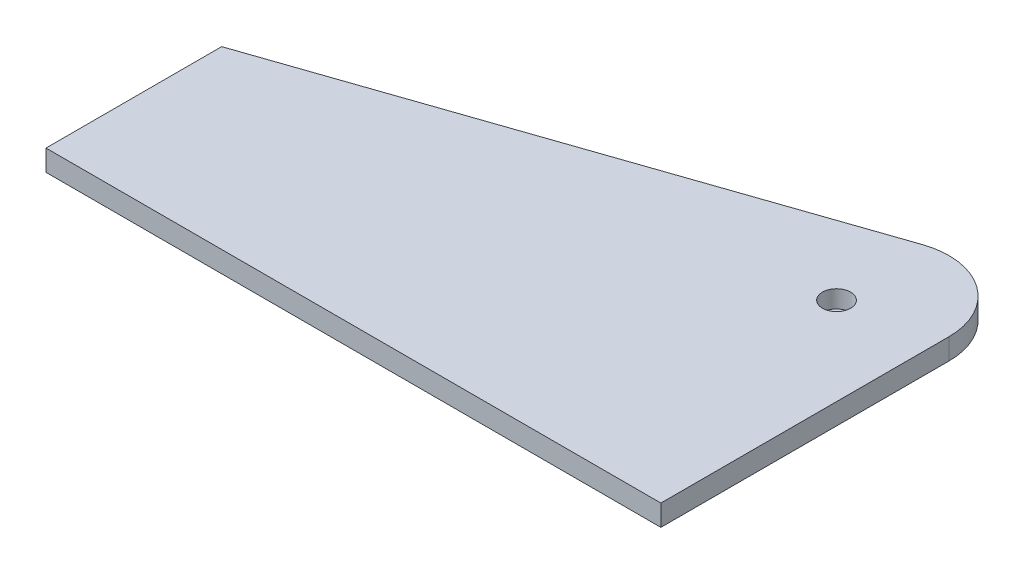
ISO-10303-21;
HEADER;
FILE_DESCRIPTION(('STEP AP214'),'2;1');
FILE_NAME('part.step','',(''),(''),'','','');
FILE_SCHEMA(('AUTOMOTIVE_DESIGN { 1 0 10303 214 1 1 1 1 }'));
ENDSEC;
DATA;
#1=APPLICATION_CONTEXT('core data for automotive mechanical design processes');
#2=APPLICATION_PROTOCOL_DEFINITION('international standard','automotive_design',2000,#1);
#3=PRODUCT_CONTEXT('',#1,'mechanical');
#4=PRODUCT('Part','Part','',(#3));
#5=PRODUCT_RELATED_PRODUCT_CATEGORY('part','',(#4));
#6=PRODUCT_DEFINITION_FORMATION('','',#4);
#7=PRODUCT_DEFINITION_CONTEXT('part definition',#1,'design');
#8=PRODUCT_DEFINITION('design','',#6,#7);
#9=PRODUCT_DEFINITION_SHAPE('','',#8);
#10=(LENGTH_UNIT() NAMED_UNIT(*) SI_UNIT(.MILLI.,.METRE.));
#11=(NAMED_UNIT(*) PLANE_ANGLE_UNIT() SI_UNIT($,.RADIAN.));
#12=(NAMED_UNIT(*) SI_UNIT($,.STERADIAN.) SOLID_ANGLE_UNIT());
#13=UNCERTAINTY_MEASURE_WITH_UNIT(LENGTH_MEASURE(1.E-05),#10,'distance_accuracy_value','');
#14=(GEOMETRIC_REPRESENTATION_CONTEXT(3) GLOBAL_UNCERTAINTY_ASSIGNED_CONTEXT((#13)) GLOBAL_UNIT_ASSIGNED_CONTEXT((#10,
#11,#12)) REPRESENTATION_CONTEXT('',''));
#15=CARTESIAN_POINT('',(0.,0.,0.));
#16=DIRECTION('',(0.,0.,1.));
#17=DIRECTION('',(1.,0.,0.));
#18=AXIS2_PLACEMENT_3D('',#15,#16,#17);
#19=CARTESIAN_POINT('',(87.5,6.,0.));
#20=DIRECTION('',(-1.,0.,0.));
#21=DIRECTION('',(0.,0.,1.));
#22=AXIS2_PLACEMENT_3D('',#19,#20,#21);
#23=PLANE('',#22);
#24=DIRECTION('',(0.,0.,-1.));
#25=VECTOR('',#24,1.);
#26=CARTESIAN_POINT('',(87.5,0.,0.));
#27=LINE('',#26,#25);
#28=CARTESIAN_POINT('',(87.5,0.,50.));
#29=VERTEX_POINT('',#28);
#30=CARTESIAN_POINT('',(87.5,0.,-32.0052135660813));
#31=VERTEX_POINT('',#30);
#32=EDGE_CURVE('E121',#29,#31,#27,.T.);
#33=ORIENTED_EDGE('',*,*,#32,.T.);
#34=DIRECTION('',(0.,-1.,0.));
#35=VECTOR('',#34,1.);
#36=CARTESIAN_POINT('',(87.5,6.,-32.0052135660813));
#37=LINE('',#36,#35);
#38=CARTESIAN_POINT('',(87.5,6.,-32.0052135660813));
#39=VERTEX_POINT('',#38);
#40=EDGE_CURVE('E50',#31,#39,#37,.F.);
#41=ORIENTED_EDGE('',*,*,#40,.T.);
#42=DIRECTION('',(0.,0.,-1.));
#43=VECTOR('',#42,1.);
#44=CARTESIAN_POINT('',(87.5,6.,0.));
#45=LINE('',#44,#43);
#46=CARTESIAN_POINT('',(87.5,6.,50.));
#47=VERTEX_POINT('',#46);
#48=EDGE_CURVE('E98',#47,#39,#45,.T.);
#49=ORIENTED_EDGE('',*,*,#48,.F.);
#50=DIRECTION('',(0.,-1.,0.));
#51=VECTOR('',#50,1.);
#52=CARTESIAN_POINT('',(87.5,6.,50.));
#53=LINE('',#52,#51);
#54=EDGE_CURVE('E117',#47,#29,#53,.T.);
#55=ORIENTED_EDGE('',*,*,#54,.T.);
#56=EDGE_LOOP('',(#33,#41,#49,#55));
#57=FACE_BOUND('',#56,.T.);
#58=ADVANCED_FACE('F41',(#57),#23,.F.);
#59=CARTESIAN_POINT('',(-87.5,6.,0.));
#60=DIRECTION('',(0.324354038365677,0.,0.945935757753071));
#61=DIRECTION('',(0.945935757753071,0.,-0.324354038365677));
#62=AXIS2_PLACEMENT_3D('',#59,#60,#61);
#63=PLANE('',#62);
#64=DIRECTION('',(-0.945935757753071,0.,0.324354038365677));
#65=VECTOR('',#64,1.);
#66=CARTESIAN_POINT('',(-87.5,6.,0.));
#67=LINE('',#66,#65);
#68=CARTESIAN_POINT('',(61.0129192326865,6.,-50.9239287211428));
#69=VERTEX_POINT('',#68);
#70=CARTESIAN_POINT('',(-87.5,6.,0.));
#71=VERTEX_POINT('',#70);
#72=EDGE_CURVE('E87',#69,#71,#67,.T.);
#73=ORIENTED_EDGE('',*,*,#72,.F.);
#74=DIRECTION('',(0.,-1.,0.));
#75=VECTOR('',#74,1.);
#76=CARTESIAN_POINT('',(61.0129192326865,6.,-50.9239287211428));
#77=LINE('',#76,#75);
#78=CARTESIAN_POINT('',(61.0129192326865,0.,-50.9239287211428));
#79=VERTEX_POINT('',#78);
#80=EDGE_CURVE('E107',#69,#79,#77,.T.);
#81=ORIENTED_EDGE('',*,*,#80,.T.);
#82=DIRECTION('',(-0.945935757753071,0.,0.324354038365677));
#83=VECTOR('',#82,1.);
#84=CARTESIAN_POINT('',(-87.5,0.,0.));
#85=LINE('',#84,#83);
#86=CARTESIAN_POINT('',(-87.5,0.,0.));
#87=VERTEX_POINT('',#86);
#88=EDGE_CURVE('E103',#79,#87,#85,.T.);
#89=ORIENTED_EDGE('',*,*,#88,.T.);
#90=DIRECTION('',(0.,-1.,0.));
#91=VECTOR('',#90,1.);
#92=CARTESIAN_POINT('',(-87.5,6.,0.));
#93=LINE('',#92,#91);
#94=EDGE_CURVE('E101',#71,#87,#93,.T.);
#95=ORIENTED_EDGE('',*,*,#94,.F.);
#96=EDGE_LOOP('',(#73,#81,#89,#95));
#97=FACE_BOUND('',#96,.T.);
#98=ADVANCED_FACE('F102',(#97),#63,.F.);
#99=CARTESIAN_POINT('',(-87.5,6.,50.));
#100=DIRECTION('',(1.,0.,0.));
#101=DIRECTION('',(0.,0.,-1.));
#102=AXIS2_PLACEMENT_3D('',#99,#100,#101);
#103=PLANE('',#102);
#104=DIRECTION('',(0.,0.,1.));
#105=VECTOR('',#104,1.);
#106=CARTESIAN_POINT('',(-87.5,0.,50.));
#107=LINE('',#106,#105);
#108=CARTESIAN_POINT('',(-87.5,0.,50.));
#109=VERTEX_POINT('',#108);
#110=EDGE_CURVE('E127',#87,#109,#107,.T.);
#111=ORIENTED_EDGE('',*,*,#110,.T.);
#112=DIRECTION('',(0.,-1.,0.));
#113=VECTOR('',#112,1.);
#114=CARTESIAN_POINT('',(-87.5,6.,50.));
#115=LINE('',#114,#113);
#116=CARTESIAN_POINT('',(-87.5,6.,50.));
#117=VERTEX_POINT('',#116);
#118=EDGE_CURVE('E108',#117,#109,#115,.T.);
#119=ORIENTED_EDGE('',*,*,#118,.F.);
#120=DIRECTION('',(0.,0.,1.));
#121=VECTOR('',#120,1.);
#122=CARTESIAN_POINT('',(-87.5,6.,50.));
#123=LINE('',#122,#121);
#124=EDGE_CURVE('E91',#71,#117,#123,.T.);
#125=ORIENTED_EDGE('',*,*,#124,.F.);
#126=ORIENTED_EDGE('',*,*,#94,.T.);
#127=EDGE_LOOP('',(#111,#119,#125,#126));
#128=FACE_BOUND('',#127,.T.);
#129=ADVANCED_FACE('F110',(#128),#103,.F.);
#130=CARTESIAN_POINT('',(-87.5,6.,50.));
#131=DIRECTION('',(0.,0.,-1.));
#132=DIRECTION('',(-1.,0.,0.));
#133=AXIS2_PLACEMENT_3D('',#130,#131,#132);
#134=PLANE('',#133);
#135=DIRECTION('',(1.,0.,0.));
#136=VECTOR('',#135,1.);
#137=CARTESIAN_POINT('',(-87.5,0.,50.));
#138=LINE('',#137,#136);
#139=EDGE_CURVE('E130',#109,#29,#138,.T.);
#140=ORIENTED_EDGE('',*,*,#139,.T.);
#141=ORIENTED_EDGE('',*,*,#54,.F.);
#142=DIRECTION('',(1.,0.,0.));
#143=VECTOR('',#142,1.);
#144=CARTESIAN_POINT('',(-87.5,6.,50.));
#145=LINE('',#144,#143);
#146=EDGE_CURVE('E114',#117,#47,#145,.T.);
#147=ORIENTED_EDGE('',*,*,#146,.F.);
#148=ORIENTED_EDGE('',*,*,#118,.T.);
#149=EDGE_LOOP('',(#140,#141,#147,#148));
#150=FACE_BOUND('',#149,.T.);
#151=ADVANCED_FACE('F147',(#150),#134,.F.);
#152=CARTESIAN_POINT('',(0.,6.,0.));
#153=DIRECTION('',(0.,1.,0.));
#154=DIRECTION('',(0.,0.,1.));
#155=AXIS2_PLACEMENT_3D('',#152,#153,#154);
#156=PLANE('',#155);
#157=CARTESIAN_POINT('',(62.5,6.,-25.));
#158=DIRECTION('',(0.,1.,0.));
#159=DIRECTION('',(0.,0.,1.));
#160=AXIS2_PLACEMENT_3D('',#157,#158,#159);
#161=CIRCLE('',#160,4.00000000000001);
#162=CARTESIAN_POINT('',(62.5,6.,-21.));
#163=VERTEX_POINT('',#162);
#164=EDGE_CURVE('E180',#163,#163,#161,.T.);
#165=ORIENTED_EDGE('',*,*,#164,.F.);
#166=EDGE_LOOP('',(#165));
#167=FACE_BOUND('',#166,.T.);
#168=ORIENTED_EDGE('',*,*,#48,.T.);
#169=CARTESIAN_POINT('',(67.5,6.,-32.0052135660813));
#170=DIRECTION('',(0.,1.,0.));
#171=DIRECTION('',(0.,0.,1.));
#172=AXIS2_PLACEMENT_3D('',#169,#170,#171);
#173=CIRCLE('',#172,20.);
#174=EDGE_CURVE('E11',#39,#69,#173,.T.);
#175=ORIENTED_EDGE('',*,*,#174,.T.);
#176=ORIENTED_EDGE('',*,*,#72,.T.);
#177=ORIENTED_EDGE('',*,*,#124,.T.);
#178=ORIENTED_EDGE('',*,*,#146,.T.);
#179=EDGE_LOOP('',(#168,#175,#176,#177,#178));
#180=FACE_BOUND('',#179,.T.);
#181=ADVANCED_FACE('F89',(#167,#180),#156,.T.);
#182=CARTESIAN_POINT('',(0.,0.,0.));
#183=DIRECTION('',(0.,1.,0.));
#184=DIRECTION('',(0.,0.,1.));
#185=AXIS2_PLACEMENT_3D('',#182,#183,#184);
#186=PLANE('',#185);
#187=ORIENTED_EDGE('',*,*,#88,.F.);
#188=CARTESIAN_POINT('',(67.5,0.,-32.0052135660813));
#189=DIRECTION('',(0.,1.,0.));
#190=DIRECTION('',(0.,0.,1.));
#191=AXIS2_PLACEMENT_3D('',#188,#189,#190);
#192=CIRCLE('',#191,20.);
#193=EDGE_CURVE('E64',#79,#31,#192,.F.);
#194=ORIENTED_EDGE('',*,*,#193,.T.);
#195=ORIENTED_EDGE('',*,*,#32,.F.);
#196=ORIENTED_EDGE('',*,*,#139,.F.);
#197=ORIENTED_EDGE('',*,*,#110,.F.);
#198=EDGE_LOOP('',(#187,#194,#195,#196,#197));
#199=FACE_BOUND('',#198,.T.);
#200=ADVANCED_FACE('F144',(#199),#186,.F.);
#201=CARTESIAN_POINT('',(67.5,6.,-32.0052135660813));
#202=DIRECTION('',(0.,-1.,0.));
#203=DIRECTION('',(0.,0.,-1.));
#204=AXIS2_PLACEMENT_3D('',#201,#202,#203);
#205=CYLINDRICAL_SURFACE('',#204,20.);
#206=ORIENTED_EDGE('',*,*,#174,.F.);
#207=ORIENTED_EDGE('',*,*,#40,.F.);
#208=ORIENTED_EDGE('',*,*,#193,.F.);
#209=ORIENTED_EDGE('',*,*,#80,.F.);
#210=EDGE_LOOP('',(#206,#207,#208,#209));
#211=FACE_BOUND('',#210,.T.);
#212=ADVANCED_FACE('F43',(#211),#205,.T.);
#213=CARTESIAN_POINT('',(62.5,1.,-25.));
#214=DIRECTION('',(0.,1.,0.));
#215=DIRECTION('',(0.,0.,1.));
#216=AXIS2_PLACEMENT_3D('',#213,#214,#215);
#217=CYLINDRICAL_SURFACE('',#216,4.00000000000001);
#218=CARTESIAN_POINT('',(62.5,1.,-25.));
#219=DIRECTION('',(0.,1.,0.));
#220=DIRECTION('',(0.,0.,1.));
#221=AXIS2_PLACEMENT_3D('',#218,#219,#220);
#222=CIRCLE('',#221,4.00000000000001);
#223=CARTESIAN_POINT('',(62.5,1.,-21.));
#224=VERTEX_POINT('',#223);
#225=EDGE_CURVE('E124',#224,#224,#222,.T.);
#226=ORIENTED_EDGE('',*,*,#225,.F.);
#227=EDGE_LOOP('',(#226));
#228=FACE_BOUND('',#227,.T.);
#229=ORIENTED_EDGE('',*,*,#164,.T.);
#230=EDGE_LOOP('',(#229));
#231=FACE_BOUND('',#230,.T.);
#232=ADVANCED_FACE('F151',(#228,#231),#217,.F.);
#233=CARTESIAN_POINT('',(62.5,1.,-25.));
#234=DIRECTION('',(0.,1.,0.));
#235=DIRECTION('',(0.,0.,1.));
#236=AXIS2_PLACEMENT_3D('',#233,#234,#235);
#237=PLANE('',#236);
#238=ORIENTED_EDGE('',*,*,#225,.T.);
#239=EDGE_LOOP('',(#238));
#240=FACE_BOUND('',#239,.T.);
#241=ADVANCED_FACE('F156',(#240),#237,.T.);
#242=CLOSED_SHELL('',(#58,#98,#129,#151,#181,#200,#212,#232,#241));
#243=MANIFOLD_SOLID_BREP('B2',#242);
#244=ADVANCED_BREP_SHAPE_REPRESENTATION('',(#18,#243),#14);
#245=SHAPE_DEFINITION_REPRESENTATION(#9,#244);
ENDSEC;
END-ISO-10303-21;
